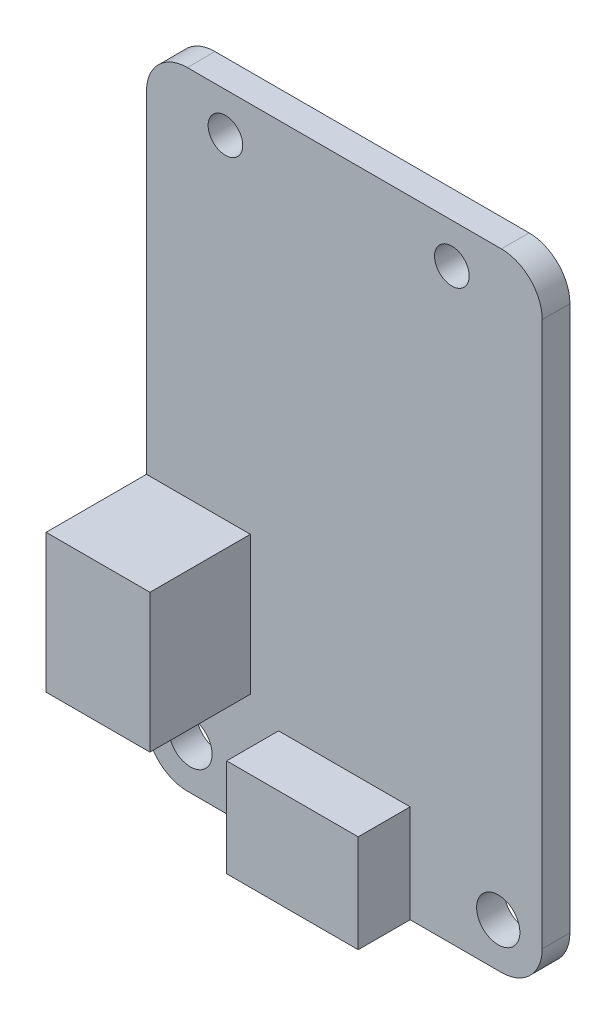
ISO-10303-21;
HEADER;
FILE_DESCRIPTION(('STEP AP214'),'2;1');
FILE_NAME('part.step','',(''),(''),'','','');
FILE_SCHEMA(('AUTOMOTIVE_DESIGN { 1 0 10303 214 1 1 1 1 }'));
ENDSEC;
DATA;
#1=APPLICATION_CONTEXT('core data for automotive mechanical design processes');
#2=APPLICATION_PROTOCOL_DEFINITION('international standard','automotive_design',2000,#1);
#3=PRODUCT_CONTEXT('',#1,'mechanical');
#4=PRODUCT('Part','Part','',(#3));
#5=PRODUCT_RELATED_PRODUCT_CATEGORY('part','',(#4));
#6=PRODUCT_DEFINITION_FORMATION('','',#4);
#7=PRODUCT_DEFINITION_CONTEXT('part definition',#1,'design');
#8=PRODUCT_DEFINITION('design','',#6,#7);
#9=PRODUCT_DEFINITION_SHAPE('','',#8);
#10=(LENGTH_UNIT() NAMED_UNIT(*) SI_UNIT(.MILLI.,.METRE.));
#11=(NAMED_UNIT(*) PLANE_ANGLE_UNIT() SI_UNIT($,.RADIAN.));
#12=(NAMED_UNIT(*) SI_UNIT($,.STERADIAN.) SOLID_ANGLE_UNIT());
#13=UNCERTAINTY_MEASURE_WITH_UNIT(LENGTH_MEASURE(1.E-05),#10,'distance_accuracy_value','');
#14=(GEOMETRIC_REPRESENTATION_CONTEXT(3) GLOBAL_UNCERTAINTY_ASSIGNED_CONTEXT((#13)) GLOBAL_UNIT_ASSIGNED_CONTEXT((#10,
#11,#12)) REPRESENTATION_CONTEXT('',''));
#15=CARTESIAN_POINT('',(0.,0.,0.));
#16=DIRECTION('',(0.,0.,1.));
#17=DIRECTION('',(1.,0.,0.));
#18=AXIS2_PLACEMENT_3D('',#15,#16,#17);
#19=CARTESIAN_POINT('',(71.9585146068358,-12.3410227938313,-6.));
#20=DIRECTION('',(0.,1.,0.));
#21=DIRECTION('',(-1.,0.,0.));
#22=AXIS2_PLACEMENT_3D('',#19,#20,#21);
#23=PLANE('',#22);
#24=DIRECTION('',(1.,0.,0.));
#25=VECTOR('',#24,1.);
#26=CARTESIAN_POINT('',(65.9585146068358,-12.3410227938313,-6.));
#27=LINE('',#26,#25);
#28=CARTESIAN_POINT('',(65.9585146068358,-12.3410227938313,-6.));
#29=VERTEX_POINT('',#28);
#30=CARTESIAN_POINT('',(71.9585146068358,-12.3410227938313,-6.));
#31=VERTEX_POINT('',#30);
#32=EDGE_CURVE('P0_E40',#29,#31,#27,.T.);
#33=ORIENTED_EDGE('',*,*,#32,.F.);
#34=DIRECTION('',(0.,0.,1.));
#35=VECTOR('',#34,1.);
#36=CARTESIAN_POINT('',(65.9585146068358,-12.3410227938313,-6.));
#37=LINE('',#36,#35);
#38=CARTESIAN_POINT('',(65.9585146068358,-12.3410227938313,-0.200000000000001));
#39=VERTEX_POINT('',#38);
#40=EDGE_CURVE('P0_E10',#29,#39,#37,.T.);
#41=ORIENTED_EDGE('',*,*,#40,.T.);
#42=DIRECTION('',(-1.,0.,0.));
#43=VECTOR('',#42,1.);
#44=CARTESIAN_POINT('',(65.9585146068358,-12.3410227938313,-0.200000000000001));
#45=LINE('',#44,#43);
#46=CARTESIAN_POINT('',(71.9585146068358,-12.3410227938313,-0.200000000000001));
#47=VERTEX_POINT('',#46);
#48=EDGE_CURVE('P0_E100',#47,#39,#45,.T.);
#49=ORIENTED_EDGE('',*,*,#48,.F.);
#50=DIRECTION('',(0.,0.,1.));
#51=VECTOR('',#50,1.);
#52=CARTESIAN_POINT('',(71.9585146068358,-12.3410227938313,-6.));
#53=LINE('',#52,#51);
#54=EDGE_CURVE('P0_E27',#31,#47,#53,.T.);
#55=ORIENTED_EDGE('',*,*,#54,.F.);
#56=EDGE_LOOP('',(#33,#41,#49,#55));
#57=FACE_BOUND('',#56,.T.);
#58=ADVANCED_FACE('P0_F16',(#57),#23,.T.);
#59=CARTESIAN_POINT('',(71.9585146068359,-20.3410227938313,-6.));
#60=DIRECTION('',(1.,0.,0.));
#61=DIRECTION('',(0.,0.,-1.));
#62=AXIS2_PLACEMENT_3D('',#59,#60,#61);
#63=PLANE('',#62);
#64=DIRECTION('',(0.,-1.,0.));
#65=VECTOR('',#64,1.);
#66=CARTESIAN_POINT('',(71.9585146068358,-12.3410227938313,-6.));
#67=LINE('',#66,#65);
#68=CARTESIAN_POINT('',(71.9585146068359,-20.3410227938313,-6.));
#69=VERTEX_POINT('',#68);
#70=EDGE_CURVE('P0_E72',#31,#69,#67,.T.);
#71=ORIENTED_EDGE('',*,*,#70,.F.);
#72=ORIENTED_EDGE('',*,*,#54,.T.);
#73=DIRECTION('',(0.,1.,0.));
#74=VECTOR('',#73,1.);
#75=CARTESIAN_POINT('',(71.9585146068358,-12.3410227938313,-0.200000000000001));
#76=LINE('',#75,#74);
#77=CARTESIAN_POINT('',(71.9585146068359,-20.3410227938313,-0.200000000000001));
#78=VERTEX_POINT('',#77);
#79=EDGE_CURVE('P0_E65',#78,#47,#76,.T.);
#80=ORIENTED_EDGE('',*,*,#79,.F.);
#81=DIRECTION('',(0.,0.,1.));
#82=VECTOR('',#81,1.);
#83=CARTESIAN_POINT('',(71.9585146068359,-20.3410227938313,-6.));
#84=LINE('',#83,#82);
#85=EDGE_CURVE('P0_E96',#69,#78,#84,.T.);
#86=ORIENTED_EDGE('',*,*,#85,.F.);
#87=EDGE_LOOP('',(#71,#72,#80,#86));
#88=FACE_BOUND('',#87,.T.);
#89=ADVANCED_FACE('P0_F160',(#88),#63,.T.);
#90=CARTESIAN_POINT('',(65.9585146068359,-20.3410227938313,-6.));
#91=DIRECTION('',(0.,-1.,0.));
#92=DIRECTION('',(0.,0.,1.));
#93=AXIS2_PLACEMENT_3D('',#90,#91,#92);
#94=PLANE('',#93);
#95=DIRECTION('',(-1.,0.,0.));
#96=VECTOR('',#95,1.);
#97=CARTESIAN_POINT('',(71.9585146068359,-20.3410227938313,-6.));
#98=LINE('',#97,#96);
#99=CARTESIAN_POINT('',(65.9585146068359,-20.3410227938313,-6.));
#100=VERTEX_POINT('',#99);
#101=EDGE_CURVE('P0_E85',#69,#100,#98,.T.);
#102=ORIENTED_EDGE('',*,*,#101,.F.);
#103=ORIENTED_EDGE('',*,*,#85,.T.);
#104=DIRECTION('',(1.,0.,0.));
#105=VECTOR('',#104,1.);
#106=CARTESIAN_POINT('',(71.9585146068359,-20.3410227938313,-0.200000000000001));
#107=LINE('',#106,#105);
#108=CARTESIAN_POINT('',(65.9585146068359,-20.3410227938313,-0.200000000000001));
#109=VERTEX_POINT('',#108);
#110=EDGE_CURVE('P0_E80',#109,#78,#107,.T.);
#111=ORIENTED_EDGE('',*,*,#110,.F.);
#112=DIRECTION('',(0.,0.,1.));
#113=VECTOR('',#112,1.);
#114=CARTESIAN_POINT('',(65.9585146068359,-20.3410227938313,-6.));
#115=LINE('',#114,#113);
#116=EDGE_CURVE('P0_E91',#100,#109,#115,.T.);
#117=ORIENTED_EDGE('',*,*,#116,.F.);
#118=EDGE_LOOP('',(#102,#103,#111,#117));
#119=FACE_BOUND('',#118,.T.);
#120=ADVANCED_FACE('P0_F18',(#119),#94,.T.);
#121=CARTESIAN_POINT('',(65.9585146068358,-12.3410227938313,-6.));
#122=DIRECTION('',(-1.,0.,0.));
#123=DIRECTION('',(0.,1.,0.));
#124=AXIS2_PLACEMENT_3D('',#121,#122,#123);
#125=PLANE('',#124);
#126=DIRECTION('',(0.,1.,0.));
#127=VECTOR('',#126,1.);
#128=CARTESIAN_POINT('',(65.9585146068359,-20.3410227938313,-6.));
#129=LINE('',#128,#127);
#130=EDGE_CURVE('P0_E88',#100,#29,#129,.T.);
#131=ORIENTED_EDGE('',*,*,#130,.F.);
#132=ORIENTED_EDGE('',*,*,#116,.T.);
#133=DIRECTION('',(0.,-1.,0.));
#134=VECTOR('',#133,1.);
#135=CARTESIAN_POINT('',(65.9585146068359,-20.3410227938313,-0.200000000000001));
#136=LINE('',#135,#134);
#137=EDGE_CURVE('P0_E20',#39,#109,#136,.T.);
#138=ORIENTED_EDGE('',*,*,#137,.F.);
#139=ORIENTED_EDGE('',*,*,#40,.F.);
#140=EDGE_LOOP('',(#131,#132,#138,#139));
#141=FACE_BOUND('',#140,.T.);
#142=ADVANCED_FACE('P0_F98',(#141),#125,.T.);
#143=CARTESIAN_POINT('',(68.9585146068358,-16.3410227938313,-0.200000000000001));
#144=DIRECTION('',(0.,0.,1.));
#145=DIRECTION('',(0.,1.,0.));
#146=AXIS2_PLACEMENT_3D('',#143,#144,#145);
#147=PLANE('',#146);
#148=ORIENTED_EDGE('',*,*,#137,.T.);
#149=ORIENTED_EDGE('',*,*,#110,.T.);
#150=ORIENTED_EDGE('',*,*,#79,.T.);
#151=ORIENTED_EDGE('',*,*,#48,.T.);
#152=EDGE_LOOP('',(#148,#149,#150,#151));
#153=FACE_BOUND('',#152,.T.);
#154=ADVANCED_FACE('P0_F119',(#153),#147,.T.);
#155=CARTESIAN_POINT('',(68.9585146068358,-16.3410227938313,-6.));
#156=DIRECTION('',(0.,0.,1.));
#157=DIRECTION('',(0.,1.,0.));
#158=AXIS2_PLACEMENT_3D('',#155,#156,#157);
#159=PLANE('',#158);
#160=ORIENTED_EDGE('',*,*,#130,.T.);
#161=ORIENTED_EDGE('',*,*,#32,.T.);
#162=ORIENTED_EDGE('',*,*,#70,.T.);
#163=ORIENTED_EDGE('',*,*,#101,.T.);
#164=EDGE_LOOP('',(#160,#161,#162,#163));
#165=FACE_BOUND('',#164,.T.);
#166=ADVANCED_FACE('P0_F86',(#165),#159,.F.);
#167=CLOSED_SHELL('',(#58,#89,#120,#142,#154,#166));
#168=MANIFOLD_SOLID_BREP('P0_B1',#167);
#169=CARTESIAN_POINT('',(81.1885146068359,-21.3610227938311,-6.));
#170=DIRECTION('',(0.,1.,0.));
#171=DIRECTION('',(-1.,0.,0.));
#172=AXIS2_PLACEMENT_3D('',#169,#170,#171);
#173=PLANE('',#172);
#174=DIRECTION('',(1.,0.,0.));
#175=VECTOR('',#174,1.);
#176=CARTESIAN_POINT('',(73.5885146068359,-21.3610227938312,-6.));
#177=LINE('',#176,#175);
#178=CARTESIAN_POINT('',(73.5885146068359,-21.3610227938312,-6.));
#179=VERTEX_POINT('',#178);
#180=CARTESIAN_POINT('',(81.1885146068359,-21.3610227938311,-6.));
#181=VERTEX_POINT('',#180);
#182=EDGE_CURVE('P1_E41',#179,#181,#177,.T.);
#183=ORIENTED_EDGE('',*,*,#182,.F.);
#184=DIRECTION('',(0.,0.,1.));
#185=VECTOR('',#184,1.);
#186=CARTESIAN_POINT('',(73.5885146068359,-21.3610227938312,-6.));
#187=LINE('',#186,#185);
#188=CARTESIAN_POINT('',(73.5885146068359,-21.3610227938312,-3.));
#189=VERTEX_POINT('',#188);
#190=EDGE_CURVE('P1_E11',#179,#189,#187,.T.);
#191=ORIENTED_EDGE('',*,*,#190,.T.);
#192=DIRECTION('',(-1.,0.,0.));
#193=VECTOR('',#192,1.);
#194=CARTESIAN_POINT('',(73.5885146068359,-21.3610227938312,-3.));
#195=LINE('',#194,#193);
#196=CARTESIAN_POINT('',(81.1885146068359,-21.3610227938311,-3.));
#197=VERTEX_POINT('',#196);
#198=EDGE_CURVE('P1_E91',#197,#189,#195,.T.);
#199=ORIENTED_EDGE('',*,*,#198,.F.);
#200=DIRECTION('',(0.,0.,1.));
#201=VECTOR('',#200,1.);
#202=CARTESIAN_POINT('',(81.1885146068359,-21.3610227938311,-6.));
#203=LINE('',#202,#201);
#204=EDGE_CURVE('P1_E28',#181,#197,#203,.T.);
#205=ORIENTED_EDGE('',*,*,#204,.F.);
#206=EDGE_LOOP('',(#183,#191,#199,#205));
#207=FACE_BOUND('',#206,.T.);
#208=ADVANCED_FACE('P1_F17',(#207),#173,.T.);
#209=CARTESIAN_POINT('',(81.188514606836,-27.0110227938311,-6.));
#210=DIRECTION('',(1.,0.,0.));
#211=DIRECTION('',(0.,-1.,0.));
#212=AXIS2_PLACEMENT_3D('',#209,#210,#211);
#213=PLANE('',#212);
#214=DIRECTION('',(0.,-1.,0.));
#215=VECTOR('',#214,1.);
#216=CARTESIAN_POINT('',(81.1885146068359,-21.3610227938311,-6.));
#217=LINE('',#216,#215);
#218=CARTESIAN_POINT('',(81.188514606836,-27.0110227938311,-6.));
#219=VERTEX_POINT('',#218);
#220=EDGE_CURVE('P1_E74',#181,#219,#217,.T.);
#221=ORIENTED_EDGE('',*,*,#220,.F.);
#222=ORIENTED_EDGE('',*,*,#204,.T.);
#223=DIRECTION('',(0.,1.,0.));
#224=VECTOR('',#223,1.);
#225=CARTESIAN_POINT('',(81.1885146068359,-21.3610227938311,-3.));
#226=LINE('',#225,#224);
#227=CARTESIAN_POINT('',(81.188514606836,-27.0110227938311,-3.));
#228=VERTEX_POINT('',#227);
#229=EDGE_CURVE('P1_E98',#228,#197,#226,.T.);
#230=ORIENTED_EDGE('',*,*,#229,.F.);
#231=DIRECTION('',(0.,0.,1.));
#232=VECTOR('',#231,1.);
#233=CARTESIAN_POINT('',(81.188514606836,-27.0110227938311,-6.));
#234=LINE('',#233,#232);
#235=EDGE_CURVE('P1_E89',#219,#228,#234,.T.);
#236=ORIENTED_EDGE('',*,*,#235,.F.);
#237=EDGE_LOOP('',(#221,#222,#230,#236));
#238=FACE_BOUND('',#237,.T.);
#239=ADVANCED_FACE('P1_F161',(#238),#213,.T.);
#240=CARTESIAN_POINT('',(73.588514606836,-27.0110227938312,-6.));
#241=DIRECTION('',(0.,-1.,0.));
#242=DIRECTION('',(-1.,0.,0.));
#243=AXIS2_PLACEMENT_3D('',#240,#241,#242);
#244=PLANE('',#243);
#245=DIRECTION('',(-1.,0.,0.));
#246=VECTOR('',#245,1.);
#247=CARTESIAN_POINT('',(81.188514606836,-27.0110227938311,-6.));
#248=LINE('',#247,#246);
#249=CARTESIAN_POINT('',(73.588514606836,-27.0110227938312,-6.));
#250=VERTEX_POINT('',#249);
#251=EDGE_CURVE('P1_E68',#219,#250,#248,.T.);
#252=ORIENTED_EDGE('',*,*,#251,.F.);
#253=ORIENTED_EDGE('',*,*,#235,.T.);
#254=DIRECTION('',(1.,0.,0.));
#255=VECTOR('',#254,1.);
#256=CARTESIAN_POINT('',(81.188514606836,-27.0110227938311,-3.));
#257=LINE('',#256,#255);
#258=CARTESIAN_POINT('',(73.588514606836,-27.0110227938312,-3.));
#259=VERTEX_POINT('',#258);
#260=EDGE_CURVE('P1_E84',#259,#228,#257,.T.);
#261=ORIENTED_EDGE('',*,*,#260,.F.);
#262=DIRECTION('',(0.,0.,1.));
#263=VECTOR('',#262,1.);
#264=CARTESIAN_POINT('',(73.588514606836,-27.0110227938312,-6.));
#265=LINE('',#264,#263);
#266=EDGE_CURVE('P1_E81',#250,#259,#265,.T.);
#267=ORIENTED_EDGE('',*,*,#266,.F.);
#268=EDGE_LOOP('',(#252,#253,#261,#267));
#269=FACE_BOUND('',#268,.T.);
#270=ADVANCED_FACE('P1_F82',(#269),#244,.T.);
#271=CARTESIAN_POINT('',(73.5885146068359,-21.3610227938312,-6.));
#272=DIRECTION('',(-1.,0.,0.));
#273=DIRECTION('',(0.,1.,0.));
#274=AXIS2_PLACEMENT_3D('',#271,#272,#273);
#275=PLANE('',#274);
#276=DIRECTION('',(0.,1.,0.));
#277=VECTOR('',#276,1.);
#278=CARTESIAN_POINT('',(73.588514606836,-27.0110227938312,-6.));
#279=LINE('',#278,#277);
#280=EDGE_CURVE('P1_E72',#250,#179,#279,.T.);
#281=ORIENTED_EDGE('',*,*,#280,.F.);
#282=ORIENTED_EDGE('',*,*,#266,.T.);
#283=DIRECTION('',(0.,-1.,0.));
#284=VECTOR('',#283,1.);
#285=CARTESIAN_POINT('',(73.588514606836,-27.0110227938312,-3.));
#286=LINE('',#285,#284);
#287=EDGE_CURVE('P1_E21',#189,#259,#286,.T.);
#288=ORIENTED_EDGE('',*,*,#287,.F.);
#289=ORIENTED_EDGE('',*,*,#190,.F.);
#290=EDGE_LOOP('',(#281,#282,#288,#289));
#291=FACE_BOUND('',#290,.T.);
#292=ADVANCED_FACE('P1_F19',(#291),#275,.T.);
#293=CARTESIAN_POINT('',(77.388514606836,-24.1860227938312,-3.));
#294=DIRECTION('',(0.,0.,1.));
#295=DIRECTION('',(0.,1.,0.));
#296=AXIS2_PLACEMENT_3D('',#293,#294,#295);
#297=PLANE('',#296);
#298=ORIENTED_EDGE('',*,*,#287,.T.);
#299=ORIENTED_EDGE('',*,*,#260,.T.);
#300=ORIENTED_EDGE('',*,*,#229,.T.);
#301=ORIENTED_EDGE('',*,*,#198,.T.);
#302=EDGE_LOOP('',(#298,#299,#300,#301));
#303=FACE_BOUND('',#302,.T.);
#304=ADVANCED_FACE('P1_F146',(#303),#297,.T.);
#305=CARTESIAN_POINT('',(77.388514606836,-24.1860227938312,-6.));
#306=DIRECTION('',(0.,0.,1.));
#307=DIRECTION('',(0.,1.,0.));
#308=AXIS2_PLACEMENT_3D('',#305,#306,#307);
#309=PLANE('',#308);
#310=ORIENTED_EDGE('',*,*,#280,.T.);
#311=ORIENTED_EDGE('',*,*,#182,.T.);
#312=ORIENTED_EDGE('',*,*,#220,.T.);
#313=ORIENTED_EDGE('',*,*,#251,.T.);
#314=EDGE_LOOP('',(#310,#311,#312,#313));
#315=FACE_BOUND('',#314,.T.);
#316=ADVANCED_FACE('P1_F70',(#315),#309,.F.);
#317=CLOSED_SHELL('',(#208,#239,#270,#292,#304,#316));
#318=MANIFOLD_SOLID_BREP('P1_B1',#317);
#319=CARTESIAN_POINT('',(86.4585146068355,6.82897720616897,-6.));
#320=DIRECTION('',(0.,0.,-1.));
#321=DIRECTION('',(0.707106781186536,0.70710678118656,0.));
#322=AXIS2_PLACEMENT_3D('',#319,#320,#321);
#323=CYLINDRICAL_SURFACE('',#322,2.36);
#324=CARTESIAN_POINT('',(86.4585146068355,6.82897720616897,-7.6));
#325=DIRECTION('',(0.,0.,1.));
#326=DIRECTION('',(0.707106781186536,0.70710678118656,0.));
#327=AXIS2_PLACEMENT_3D('',#324,#325,#326);
#328=CIRCLE('',#327,2.36);
#329=CARTESIAN_POINT('',(88.8185146068355,6.828977206169,-7.6));
#330=VERTEX_POINT('',#329);
#331=CARTESIAN_POINT('',(86.4585146068355,9.18897720616897,-7.6));
#332=VERTEX_POINT('',#331);
#333=EDGE_CURVE('P2_E11',#330,#332,#328,.T.);
#334=ORIENTED_EDGE('',*,*,#333,.T.);
#335=DIRECTION('',(0.,0.,1.));
#336=VECTOR('',#335,1.);
#337=CARTESIAN_POINT('',(86.4585146068355,9.18897720616897,-6.));
#338=LINE('',#337,#336);
#339=CARTESIAN_POINT('',(86.4585146068355,9.18897720616897,-6.));
#340=VERTEX_POINT('',#339);
#341=EDGE_CURVE('P2_E28',#332,#340,#338,.T.);
#342=ORIENTED_EDGE('',*,*,#341,.T.);
#343=CARTESIAN_POINT('',(86.4585146068355,6.82897720616897,-6.));
#344=DIRECTION('',(0.,0.,-1.));
#345=DIRECTION('',(0.707106781186536,0.70710678118656,0.));
#346=AXIS2_PLACEMENT_3D('',#343,#344,#345);
#347=CIRCLE('',#346,2.36);
#348=CARTESIAN_POINT('',(88.8185146068355,6.828977206169,-6.));
#349=VERTEX_POINT('',#348);
#350=EDGE_CURVE('P2_E212',#340,#349,#347,.T.);
#351=ORIENTED_EDGE('',*,*,#350,.T.);
#352=DIRECTION('',(0.,0.,-1.));
#353=VECTOR('',#352,1.);
#354=CARTESIAN_POINT('',(88.8185146068355,6.828977206169,-6.));
#355=LINE('',#354,#353);
#356=EDGE_CURVE('P2_E201',#349,#330,#355,.T.);
#357=ORIENTED_EDGE('',*,*,#356,.T.);
#358=EDGE_LOOP('',(#334,#342,#351,#357));
#359=FACE_BOUND('',#358,.T.);
#360=ADVANCED_FACE('P2_F17',(#359),#323,.T.);
#361=CARTESIAN_POINT('',(88.8185146068355,9.188977206169,-6.));
#362=DIRECTION('',(1.,0.,0.));
#363=DIRECTION('',(0.,0.,-1.));
#364=AXIS2_PLACEMENT_3D('',#361,#362,#363);
#365=PLANE('',#364);
#366=ORIENTED_EDGE('',*,*,#356,.F.);
#367=DIRECTION('',(0.,1.,0.));
#368=VECTOR('',#367,1.);
#369=CARTESIAN_POINT('',(88.818514606836,-27.011022793831,-6.));
#370=LINE('',#369,#368);
#371=CARTESIAN_POINT('',(88.818514606836,-24.651022793831,-6.));
#372=VERTEX_POINT('',#371);
#373=EDGE_CURVE('P2_E213',#372,#349,#370,.T.);
#374=ORIENTED_EDGE('',*,*,#373,.F.);
#375=DIRECTION('',(0.,0.,1.));
#376=VECTOR('',#375,1.);
#377=CARTESIAN_POINT('',(88.818514606836,-24.651022793831,-6.));
#378=LINE('',#377,#376);
#379=CARTESIAN_POINT('',(88.818514606836,-24.651022793831,-7.6));
#380=VERTEX_POINT('',#379);
#381=EDGE_CURVE('P2_E179',#380,#372,#378,.T.);
#382=ORIENTED_EDGE('',*,*,#381,.F.);
#383=DIRECTION('',(0.,-1.,0.));
#384=VECTOR('',#383,1.);
#385=CARTESIAN_POINT('',(88.818514606836,-27.011022793831,-7.6));
#386=LINE('',#385,#384);
#387=EDGE_CURVE('P2_E170',#330,#380,#386,.T.);
#388=ORIENTED_EDGE('',*,*,#387,.F.);
#389=EDGE_LOOP('',(#366,#374,#382,#388));
#390=FACE_BOUND('',#389,.T.);
#391=ADVANCED_FACE('P2_F284',(#390),#365,.T.);
#392=CARTESIAN_POINT('',(77.3885146068357,-8.91102279383117,-6.));
#393=DIRECTION('',(0.,0.,1.));
#394=DIRECTION('',(0.,1.,0.));
#395=AXIS2_PLACEMENT_3D('',#392,#393,#394);
#396=PLANE('',#395);
#397=ORIENTED_EDGE('',*,*,#350,.F.);
#398=DIRECTION('',(-1.,0.,0.));
#399=VECTOR('',#398,1.);
#400=CARTESIAN_POINT('',(88.8185146068355,9.188977206169,-6.));
#401=LINE('',#400,#399);
#402=CARTESIAN_POINT('',(68.3185146068354,9.1889772061687,-6.));
#403=VERTEX_POINT('',#402);
#404=EDGE_CURVE('P2_E197',#340,#403,#401,.T.);
#405=ORIENTED_EDGE('',*,*,#404,.T.);
#406=CARTESIAN_POINT('',(68.3185146068355,6.8289772061687,-6.));
#407=DIRECTION('',(0.,0.,-1.));
#408=DIRECTION('',(-0.707106781186559,0.707106781186537,0.));
#409=AXIS2_PLACEMENT_3D('',#406,#407,#408);
#410=CIRCLE('',#409,2.36);
#411=CARTESIAN_POINT('',(65.9585146068355,6.82897720616866,-6.));
#412=VERTEX_POINT('',#411);
#413=EDGE_CURVE('P2_E164',#412,#403,#410,.T.);
#414=ORIENTED_EDGE('',*,*,#413,.F.);
#415=DIRECTION('',(0.,1.,0.));
#416=VECTOR('',#415,1.);
#417=CARTESIAN_POINT('',(65.9585146068359,-20.3410227938313,-6.));
#418=LINE('',#417,#416);
#419=CARTESIAN_POINT('',(65.958514606836,-24.6510227938313,-6.));
#420=VERTEX_POINT('',#419);
#421=EDGE_CURVE('P2_E193',#420,#412,#418,.T.);
#422=ORIENTED_EDGE('',*,*,#421,.F.);
#423=CARTESIAN_POINT('',(68.318514606836,-24.6510227938313,-6.));
#424=DIRECTION('',(0.,0.,-1.));
#425=DIRECTION('',(-0.707106781186537,-0.707106781186559,0.));
#426=AXIS2_PLACEMENT_3D('',#423,#424,#425);
#427=CIRCLE('',#426,2.36);
#428=CARTESIAN_POINT('',(68.318514606836,-27.0110227938313,-6.));
#429=VERTEX_POINT('',#428);
#430=EDGE_CURVE('P2_E192',#429,#420,#427,.T.);
#431=ORIENTED_EDGE('',*,*,#430,.F.);
#432=DIRECTION('',(1.,0.,0.));
#433=VECTOR('',#432,1.);
#434=CARTESIAN_POINT('',(65.958514606836,-27.0110227938313,-6.));
#435=LINE('',#434,#433);
#436=CARTESIAN_POINT('',(86.458514606836,-27.011022793831,-6.));
#437=VERTEX_POINT('',#436);
#438=EDGE_CURVE('P2_E202',#429,#437,#435,.T.);
#439=ORIENTED_EDGE('',*,*,#438,.T.);
#440=CARTESIAN_POINT('',(86.458514606836,-24.651022793831,-6.));
#441=DIRECTION('',(0.,0.,-1.));
#442=DIRECTION('',(0.707106781186559,-0.707106781186537,0.));
#443=AXIS2_PLACEMENT_3D('',#440,#441,#442);
#444=CIRCLE('',#443,2.36);
#445=EDGE_CURVE('P2_E71',#372,#437,#444,.T.);
#446=ORIENTED_EDGE('',*,*,#445,.F.);
#447=ORIENTED_EDGE('',*,*,#373,.T.);
#448=EDGE_LOOP('',(#397,#405,#414,#422,#431,#439,#446,#447));
#449=FACE_BOUND('',#448,.T.);
#450=CARTESIAN_POINT('',(68.4985192534039,-24.4581685364235,-6.));
#451=DIRECTION('',(0.,0.,-1.));
#452=DIRECTION('',(0.,1.,0.));
#453=AXIS2_PLACEMENT_3D('',#450,#451,#452);
#454=CIRCLE('',#453,1.25);
#455=CARTESIAN_POINT('',(68.4985192534039,-25.7081685364235,-6.));
#456=VERTEX_POINT('',#455);
#457=EDGE_CURVE('P2_E86',#456,#456,#454,.T.);
#458=ORIENTED_EDGE('',*,*,#457,.T.);
#459=EDGE_LOOP('',(#458));
#460=FACE_BOUND('',#459,.T.);
#461=CARTESIAN_POINT('',(86.278514606836,-24.471022793831,-6.));
#462=DIRECTION('',(0.,0.,-1.));
#463=DIRECTION('',(0.,1.,0.));
#464=AXIS2_PLACEMENT_3D('',#461,#462,#463);
#465=CIRCLE('',#464,1.25);
#466=CARTESIAN_POINT('',(86.278514606836,-25.721022793831,-6.));
#467=VERTEX_POINT('',#466);
#468=EDGE_CURVE('P2_E206',#467,#467,#465,.T.);
#469=ORIENTED_EDGE('',*,*,#468,.T.);
#470=EDGE_LOOP('',(#469));
#471=FACE_BOUND('',#470,.T.);
#472=CARTESIAN_POINT('',(83.5985146068355,6.89797720616893,-6.));
#473=DIRECTION('',(0.,0.,-1.));
#474=DIRECTION('',(0.,1.,0.));
#475=AXIS2_PLACEMENT_3D('',#472,#473,#474);
#476=CIRCLE('',#475,1.);
#477=CARTESIAN_POINT('',(83.5985146068355,5.89797720616892,-6.));
#478=VERTEX_POINT('',#477);
#479=EDGE_CURVE('P2_E21',#478,#478,#476,.T.);
#480=ORIENTED_EDGE('',*,*,#479,.T.);
#481=EDGE_LOOP('',(#480));
#482=FACE_BOUND('',#481,.T.);
#483=CARTESIAN_POINT('',(70.5185146068355,6.89797720616872,-6.));
#484=DIRECTION('',(0.,0.,-1.));
#485=DIRECTION('',(0.,1.,0.));
#486=AXIS2_PLACEMENT_3D('',#483,#484,#485);
#487=CIRCLE('',#486,1.);
#488=CARTESIAN_POINT('',(70.5185146068355,5.89797720616872,-6.));
#489=VERTEX_POINT('',#488);
#490=EDGE_CURVE('P2_E183',#489,#489,#487,.T.);
#491=ORIENTED_EDGE('',*,*,#490,.T.);
#492=EDGE_LOOP('',(#491));
#493=FACE_BOUND('',#492,.T.);
#494=ADVANCED_FACE('P2_F290',(#449,#460,#471,#482,#493),#396,.T.);
#495=CARTESIAN_POINT('',(68.3185146068355,6.8289772061687,-6.));
#496=DIRECTION('',(0.,0.,-1.));
#497=DIRECTION('',(-0.707106781186559,0.707106781186537,0.));
#498=AXIS2_PLACEMENT_3D('',#495,#496,#497);
#499=CYLINDRICAL_SURFACE('',#498,2.36);
#500=CARTESIAN_POINT('',(68.3185146068355,6.8289772061687,-7.6));
#501=DIRECTION('',(0.,0.,1.));
#502=DIRECTION('',(-0.707106781186559,0.707106781186537,0.));
#503=AXIS2_PLACEMENT_3D('',#500,#501,#502);
#504=CIRCLE('',#503,2.36);
#505=CARTESIAN_POINT('',(68.3185146068354,9.1889772061687,-7.6));
#506=VERTEX_POINT('',#505);
#507=CARTESIAN_POINT('',(65.9585146068355,6.82897720616866,-7.6));
#508=VERTEX_POINT('',#507);
#509=EDGE_CURVE('P2_E175',#506,#508,#504,.T.);
#510=ORIENTED_EDGE('',*,*,#509,.T.);
#511=DIRECTION('',(0.,0.,1.));
#512=VECTOR('',#511,1.);
#513=CARTESIAN_POINT('',(65.9585146068355,6.82897720616866,-6.));
#514=LINE('',#513,#512);
#515=EDGE_CURVE('P2_E171',#508,#412,#514,.T.);
#516=ORIENTED_EDGE('',*,*,#515,.T.);
#517=ORIENTED_EDGE('',*,*,#413,.T.);
#518=DIRECTION('',(0.,0.,-1.));
#519=VECTOR('',#518,1.);
#520=CARTESIAN_POINT('',(68.3185146068354,9.1889772061687,-6.));
#521=LINE('',#520,#519);
#522=EDGE_CURVE('P2_E196',#403,#506,#521,.T.);
#523=ORIENTED_EDGE('',*,*,#522,.T.);
#524=EDGE_LOOP('',(#510,#516,#517,#523));
#525=FACE_BOUND('',#524,.T.);
#526=ADVANCED_FACE('P2_F19',(#525),#499,.T.);
#527=CARTESIAN_POINT('',(65.958514606836,-27.0110227938313,-6.));
#528=DIRECTION('',(-1.,0.,0.));
#529=DIRECTION('',(0.,1.,0.));
#530=AXIS2_PLACEMENT_3D('',#527,#528,#529);
#531=PLANE('',#530);
#532=ORIENTED_EDGE('',*,*,#515,.F.);
#533=DIRECTION('',(0.,1.,0.));
#534=VECTOR('',#533,1.);
#535=CARTESIAN_POINT('',(65.9585146068359,-20.3410227938313,-7.6));
#536=LINE('',#535,#534);
#537=CARTESIAN_POINT('',(65.958514606836,-24.6510227938313,-7.6));
#538=VERTEX_POINT('',#537);
#539=EDGE_CURVE('P2_E250',#538,#508,#536,.T.);
#540=ORIENTED_EDGE('',*,*,#539,.F.);
#541=DIRECTION('',(0.,0.,-1.));
#542=VECTOR('',#541,1.);
#543=CARTESIAN_POINT('',(65.958514606836,-24.6510227938313,-6.));
#544=LINE('',#543,#542);
#545=EDGE_CURVE('P2_E219',#420,#538,#544,.T.);
#546=ORIENTED_EDGE('',*,*,#545,.F.);
#547=ORIENTED_EDGE('',*,*,#421,.T.);
#548=EDGE_LOOP('',(#532,#540,#546,#547));
#549=FACE_BOUND('',#548,.T.);
#550=ADVANCED_FACE('P2_F302',(#549),#531,.T.);
#551=CARTESIAN_POINT('',(68.318514606836,-24.6510227938313,-6.));
#552=DIRECTION('',(0.,0.,-1.));
#553=DIRECTION('',(-0.707106781186537,-0.707106781186559,0.));
#554=AXIS2_PLACEMENT_3D('',#551,#552,#553);
#555=CYLINDRICAL_SURFACE('',#554,2.36);
#556=CARTESIAN_POINT('',(68.318514606836,-24.6510227938313,-7.6));
#557=DIRECTION('',(0.,0.,1.));
#558=DIRECTION('',(-0.707106781186537,-0.707106781186559,0.));
#559=AXIS2_PLACEMENT_3D('',#556,#557,#558);
#560=CIRCLE('',#559,2.36);
#561=CARTESIAN_POINT('',(68.318514606836,-27.0110227938313,-7.6));
#562=VERTEX_POINT('',#561);
#563=EDGE_CURVE('P2_E191',#538,#562,#560,.T.);
#564=ORIENTED_EDGE('',*,*,#563,.T.);
#565=DIRECTION('',(0.,0.,1.));
#566=VECTOR('',#565,1.);
#567=CARTESIAN_POINT('',(68.318514606836,-27.0110227938313,-6.));
#568=LINE('',#567,#566);
#569=EDGE_CURVE('P2_E187',#562,#429,#568,.T.);
#570=ORIENTED_EDGE('',*,*,#569,.T.);
#571=ORIENTED_EDGE('',*,*,#430,.T.);
#572=ORIENTED_EDGE('',*,*,#545,.T.);
#573=EDGE_LOOP('',(#564,#570,#571,#572));
#574=FACE_BOUND('',#573,.T.);
#575=ADVANCED_FACE('P2_F295',(#574),#555,.T.);
#576=CARTESIAN_POINT('',(86.458514606836,-24.651022793831,-6.));
#577=DIRECTION('',(0.,0.,-1.));
#578=DIRECTION('',(0.707106781186559,-0.707106781186537,0.));
#579=AXIS2_PLACEMENT_3D('',#576,#577,#578);
#580=CYLINDRICAL_SURFACE('',#579,2.36);
#581=CARTESIAN_POINT('',(86.458514606836,-24.651022793831,-7.6));
#582=DIRECTION('',(0.,0.,1.));
#583=DIRECTION('',(0.707106781186559,-0.707106781186537,0.));
#584=AXIS2_PLACEMENT_3D('',#581,#582,#583);
#585=CIRCLE('',#584,2.36);
#586=CARTESIAN_POINT('',(86.458514606836,-27.011022793831,-7.6));
#587=VERTEX_POINT('',#586);
#588=EDGE_CURVE('P2_E182',#587,#380,#585,.T.);
#589=ORIENTED_EDGE('',*,*,#588,.T.);
#590=ORIENTED_EDGE('',*,*,#381,.T.);
#591=ORIENTED_EDGE('',*,*,#445,.T.);
#592=DIRECTION('',(0.,0.,-1.));
#593=VECTOR('',#592,1.);
#594=CARTESIAN_POINT('',(86.458514606836,-27.011022793831,-6.));
#595=LINE('',#594,#593);
#596=EDGE_CURVE('P2_E236',#437,#587,#595,.T.);
#597=ORIENTED_EDGE('',*,*,#596,.T.);
#598=EDGE_LOOP('',(#589,#590,#591,#597));
#599=FACE_BOUND('',#598,.T.);
#600=ADVANCED_FACE('P2_F309',(#599),#580,.T.);
#601=CARTESIAN_POINT('',(70.5185146068355,6.89797720616872,-6.));
#602=DIRECTION('',(0.,0.,-1.));
#603=DIRECTION('',(0.,1.,0.));
#604=AXIS2_PLACEMENT_3D('',#601,#602,#603);
#605=CYLINDRICAL_SURFACE('',#604,1.);
#606=CARTESIAN_POINT('',(70.5185146068355,6.89797720616872,-7.6));
#607=DIRECTION('',(0.,0.,1.));
#608=DIRECTION('',(0.,1.,0.));
#609=AXIS2_PLACEMENT_3D('',#606,#607,#608);
#610=CIRCLE('',#609,1.);
#611=CARTESIAN_POINT('',(70.5185146068355,5.89797720616872,-7.6));
#612=VERTEX_POINT('',#611);
#613=EDGE_CURVE('P2_E150',#612,#612,#610,.T.);
#614=ORIENTED_EDGE('',*,*,#613,.F.);
#615=DIRECTION('',(0.,0.,1.));
#616=VECTOR('',#615,1.);
#617=CARTESIAN_POINT('',(70.5185146068355,5.89797720616872,-6.));
#618=LINE('',#617,#616);
#619=EDGE_CURVE('P2_E205',#612,#489,#618,.T.);
#620=ORIENTED_EDGE('',*,*,#619,.T.);
#621=ORIENTED_EDGE('',*,*,#490,.F.);
#622=ORIENTED_EDGE('',*,*,#619,.F.);
#623=EDGE_LOOP('',(#614,#620,#621,#622));
#624=FACE_BOUND('',#623,.T.);
#625=ADVANCED_FACE('P2_F409',(#624),#605,.F.);
#626=CARTESIAN_POINT('',(83.5985146068355,6.89797720616893,-6.));
#627=DIRECTION('',(0.,0.,-1.));
#628=DIRECTION('',(0.,1.,0.));
#629=AXIS2_PLACEMENT_3D('',#626,#627,#628);
#630=CYLINDRICAL_SURFACE('',#629,1.);
#631=CARTESIAN_POINT('',(83.5985146068355,6.89797720616893,-7.6));
#632=DIRECTION('',(0.,0.,1.));
#633=DIRECTION('',(0.,1.,0.));
#634=AXIS2_PLACEMENT_3D('',#631,#632,#633);
#635=CIRCLE('',#634,1.);
#636=CARTESIAN_POINT('',(83.5985146068355,5.89797720616892,-7.6));
#637=VERTEX_POINT('',#636);
#638=EDGE_CURVE('P2_E143',#637,#637,#635,.T.);
#639=ORIENTED_EDGE('',*,*,#638,.F.);
#640=DIRECTION('',(0.,0.,1.));
#641=VECTOR('',#640,1.);
#642=CARTESIAN_POINT('',(83.5985146068355,5.89797720616892,-6.));
#643=LINE('',#642,#641);
#644=EDGE_CURVE('P2_E146',#637,#478,#643,.T.);
#645=ORIENTED_EDGE('',*,*,#644,.T.);
#646=ORIENTED_EDGE('',*,*,#479,.F.);
#647=ORIENTED_EDGE('',*,*,#644,.F.);
#648=EDGE_LOOP('',(#639,#645,#646,#647));
#649=FACE_BOUND('',#648,.T.);
#650=ADVANCED_FACE('P2_F144',(#649),#630,.F.);
#651=CARTESIAN_POINT('',(86.278514606836,-24.471022793831,-6.));
#652=DIRECTION('',(0.,0.,-1.));
#653=DIRECTION('',(0.,1.,0.));
#654=AXIS2_PLACEMENT_3D('',#651,#652,#653);
#655=CYLINDRICAL_SURFACE('',#654,1.25);
#656=CARTESIAN_POINT('',(86.278514606836,-24.471022793831,-7.6));
#657=DIRECTION('',(0.,0.,1.));
#658=DIRECTION('',(0.,1.,0.));
#659=AXIS2_PLACEMENT_3D('',#656,#657,#658);
#660=CIRCLE('',#659,1.25);
#661=CARTESIAN_POINT('',(86.278514606836,-25.721022793831,-7.6));
#662=VERTEX_POINT('',#661);
#663=EDGE_CURVE('P2_E149',#662,#662,#660,.T.);
#664=ORIENTED_EDGE('',*,*,#663,.F.);
#665=DIRECTION('',(0.,0.,1.));
#666=VECTOR('',#665,1.);
#667=CARTESIAN_POINT('',(86.278514606836,-25.721022793831,-6.));
#668=LINE('',#667,#666);
#669=EDGE_CURVE('P2_E169',#662,#467,#668,.T.);
#670=ORIENTED_EDGE('',*,*,#669,.T.);
#671=ORIENTED_EDGE('',*,*,#468,.F.);
#672=ORIENTED_EDGE('',*,*,#669,.F.);
#673=EDGE_LOOP('',(#664,#670,#671,#672));
#674=FACE_BOUND('',#673,.T.);
#675=ADVANCED_FACE('P2_F271',(#674),#655,.F.);
#676=CARTESIAN_POINT('',(68.4985192534039,-24.4581685364235,-6.));
#677=DIRECTION('',(0.,0.,-1.));
#678=DIRECTION('',(0.,1.,0.));
#679=AXIS2_PLACEMENT_3D('',#676,#677,#678);
#680=CYLINDRICAL_SURFACE('',#679,1.25);
#681=CARTESIAN_POINT('',(68.4985192534039,-24.4581685364235,-7.6));
#682=DIRECTION('',(0.,0.,1.));
#683=DIRECTION('',(0.,1.,0.));
#684=AXIS2_PLACEMENT_3D('',#681,#682,#683);
#685=CIRCLE('',#684,1.25);
#686=CARTESIAN_POINT('',(68.4985192534039,-25.7081685364235,-7.6));
#687=VERTEX_POINT('',#686);
#688=EDGE_CURVE('P2_E158',#687,#687,#685,.T.);
#689=ORIENTED_EDGE('',*,*,#688,.F.);
#690=DIRECTION('',(0.,0.,1.));
#691=VECTOR('',#690,1.);
#692=CARTESIAN_POINT('',(68.4985192534039,-25.7081685364235,-6.));
#693=LINE('',#692,#691);
#694=EDGE_CURVE('P2_E166',#687,#456,#693,.T.);
#695=ORIENTED_EDGE('',*,*,#694,.T.);
#696=ORIENTED_EDGE('',*,*,#457,.F.);
#697=ORIENTED_EDGE('',*,*,#694,.F.);
#698=EDGE_LOOP('',(#689,#695,#696,#697));
#699=FACE_BOUND('',#698,.T.);
#700=ADVANCED_FACE('P2_F268',(#699),#680,.F.);
#701=CARTESIAN_POINT('',(65.9585146068355,9.18897720616866,-6.));
#702=DIRECTION('',(0.,1.,0.));
#703=DIRECTION('',(-1.,0.,0.));
#704=AXIS2_PLACEMENT_3D('',#701,#702,#703);
#705=PLANE('',#704);
#706=ORIENTED_EDGE('',*,*,#341,.F.);
#707=DIRECTION('',(1.,0.,0.));
#708=VECTOR('',#707,1.);
#709=CARTESIAN_POINT('',(88.8185146068355,9.188977206169,-7.6));
#710=LINE('',#709,#708);
#711=EDGE_CURVE('P2_E251',#506,#332,#710,.T.);
#712=ORIENTED_EDGE('',*,*,#711,.F.);
#713=ORIENTED_EDGE('',*,*,#522,.F.);
#714=ORIENTED_EDGE('',*,*,#404,.F.);
#715=EDGE_LOOP('',(#706,#712,#713,#714));
#716=FACE_BOUND('',#715,.T.);
#717=ADVANCED_FACE('P2_F270',(#716),#705,.T.);
#718=CARTESIAN_POINT('',(88.818514606836,-27.011022793831,-6.));
#719=DIRECTION('',(0.,-1.,0.));
#720=DIRECTION('',(-1.,0.,0.));
#721=AXIS2_PLACEMENT_3D('',#718,#719,#720);
#722=PLANE('',#721);
#723=ORIENTED_EDGE('',*,*,#569,.F.);
#724=DIRECTION('',(-1.,0.,0.));
#725=VECTOR('',#724,1.);
#726=CARTESIAN_POINT('',(65.958514606836,-27.0110227938313,-7.6));
#727=LINE('',#726,#725);
#728=EDGE_CURVE('P2_E229',#587,#562,#727,.T.);
#729=ORIENTED_EDGE('',*,*,#728,.F.);
#730=ORIENTED_EDGE('',*,*,#596,.F.);
#731=ORIENTED_EDGE('',*,*,#438,.F.);
#732=EDGE_LOOP('',(#723,#729,#730,#731));
#733=FACE_BOUND('',#732,.T.);
#734=ADVANCED_FACE('P2_F278',(#733),#722,.T.);
#735=CARTESIAN_POINT('',(77.3885146068357,-8.91102279383117,-7.6));
#736=DIRECTION('',(0.,0.,1.));
#737=DIRECTION('',(0.,1.,0.));
#738=AXIS2_PLACEMENT_3D('',#735,#736,#737);
#739=PLANE('',#738);
#740=ORIENTED_EDGE('',*,*,#333,.F.);
#741=ORIENTED_EDGE('',*,*,#387,.T.);
#742=ORIENTED_EDGE('',*,*,#588,.F.);
#743=ORIENTED_EDGE('',*,*,#728,.T.);
#744=ORIENTED_EDGE('',*,*,#563,.F.);
#745=ORIENTED_EDGE('',*,*,#539,.T.);
#746=ORIENTED_EDGE('',*,*,#509,.F.);
#747=ORIENTED_EDGE('',*,*,#711,.T.);
#748=EDGE_LOOP('',(#740,#741,#742,#743,#744,#745,#746,#747));
#749=FACE_BOUND('',#748,.T.);
#750=ORIENTED_EDGE('',*,*,#688,.T.);
#751=EDGE_LOOP('',(#750));
#752=FACE_BOUND('',#751,.T.);
#753=ORIENTED_EDGE('',*,*,#663,.T.);
#754=EDGE_LOOP('',(#753));
#755=FACE_BOUND('',#754,.T.);
#756=ORIENTED_EDGE('',*,*,#638,.T.);
#757=EDGE_LOOP('',(#756));
#758=FACE_BOUND('',#757,.T.);
#759=ORIENTED_EDGE('',*,*,#613,.T.);
#760=EDGE_LOOP('',(#759));
#761=FACE_BOUND('',#760,.T.);
#762=ADVANCED_FACE('P2_F266',(#749,#752,#755,#758,#761),#739,.F.);
#763=CLOSED_SHELL('',(#360,#391,#494,#526,#550,#575,#600,#625,#650,#675,#700,#717,#734,#762));
#764=MANIFOLD_SOLID_BREP('P2_B1',#763);
#765=ADVANCED_BREP_SHAPE_REPRESENTATION('',(#18,#168,#318,#764),#14);
#766=SHAPE_DEFINITION_REPRESENTATION(#9,#765);
ENDSEC;
END-ISO-10303-21;
